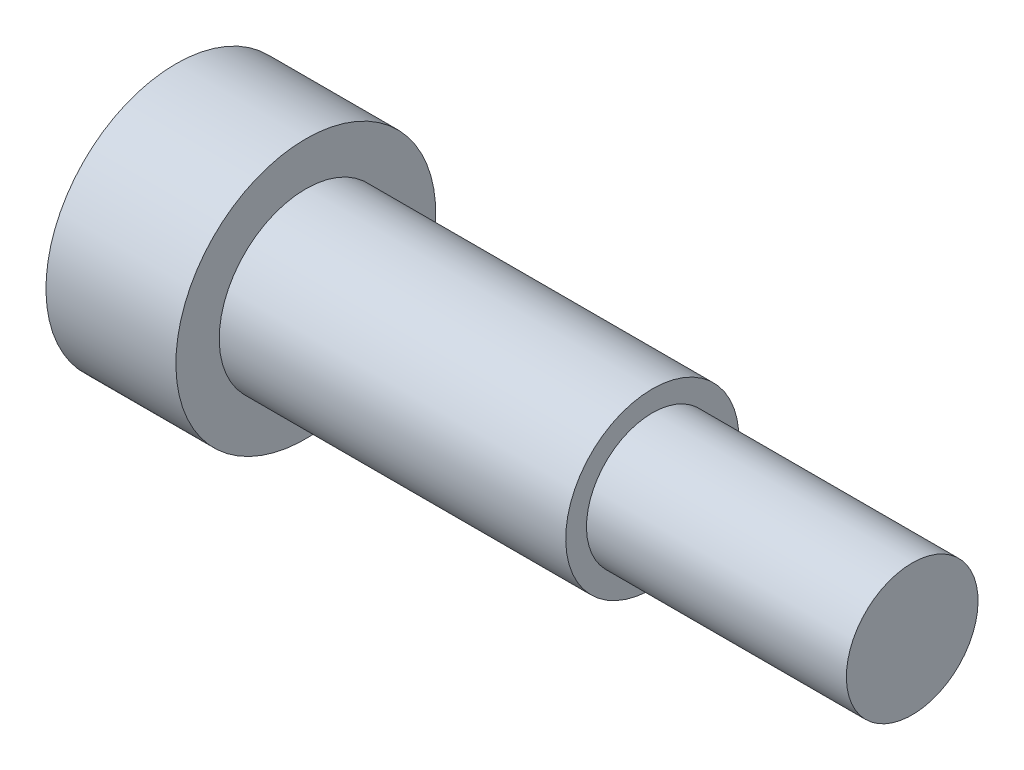
ISO-10303-21;
HEADER;
FILE_DESCRIPTION(('STEP AP214'),'2;1');
FILE_NAME('part.step','',(''),(''),'','','');
FILE_SCHEMA(('AUTOMOTIVE_DESIGN { 1 0 10303 214 1 1 1 1 }'));
ENDSEC;
DATA;
#1=APPLICATION_CONTEXT('core data for automotive mechanical design processes');
#2=APPLICATION_PROTOCOL_DEFINITION('international standard','automotive_design',2000,#1);
#3=PRODUCT_CONTEXT('',#1,'mechanical');
#4=PRODUCT('Part','Part','',(#3));
#5=PRODUCT_RELATED_PRODUCT_CATEGORY('part','',(#4));
#6=PRODUCT_DEFINITION_FORMATION('','',#4);
#7=PRODUCT_DEFINITION_CONTEXT('part definition',#1,'design');
#8=PRODUCT_DEFINITION('design','',#6,#7);
#9=PRODUCT_DEFINITION_SHAPE('','',#8);
#10=(LENGTH_UNIT() NAMED_UNIT(*) SI_UNIT(.MILLI.,.METRE.));
#11=(NAMED_UNIT(*) PLANE_ANGLE_UNIT() SI_UNIT($,.RADIAN.));
#12=(NAMED_UNIT(*) SI_UNIT($,.STERADIAN.) SOLID_ANGLE_UNIT());
#13=UNCERTAINTY_MEASURE_WITH_UNIT(LENGTH_MEASURE(1.E-05),#10,'distance_accuracy_value','');
#14=(GEOMETRIC_REPRESENTATION_CONTEXT(3) GLOBAL_UNCERTAINTY_ASSIGNED_CONTEXT((#13)) GLOBAL_UNIT_ASSIGNED_CONTEXT((#10,
#11,#12)) REPRESENTATION_CONTEXT('',''));
#15=CARTESIAN_POINT('',(0.,0.,0.));
#16=DIRECTION('',(0.,0.,1.));
#17=DIRECTION('',(1.,0.,0.));
#18=AXIS2_PLACEMENT_3D('',#15,#16,#17);
#19=CARTESIAN_POINT('',(0.,0.,0.));
#20=DIRECTION('',(-1.,0.,0.));
#21=DIRECTION('',(0.,-1.,0.));
#22=AXIS2_PLACEMENT_3D('',#19,#20,#21);
#23=PLANE('',#22);
#24=CARTESIAN_POINT('',(0.,0.,0.));
#25=DIRECTION('',(1.,0.,0.));
#26=DIRECTION('',(0.,1.,0.));
#27=AXIS2_PLACEMENT_3D('',#24,#25,#26);
#28=CIRCLE('',#27,4.7625);
#29=CARTESIAN_POINT('',(0.,4.7625,0.));
#30=VERTEX_POINT('',#29);
#31=EDGE_CURVE('E10',#30,#30,#28,.T.);
#32=ORIENTED_EDGE('',*,*,#31,.F.);
#33=EDGE_LOOP('',(#32));
#34=FACE_BOUND('',#33,.T.);
#35=ADVANCED_FACE('F37',(#34),#23,.T.);
#36=CARTESIAN_POINT('',(26.9875,0.,0.));
#37=DIRECTION('',(1.,0.,0.));
#38=DIRECTION('',(0.,1.,0.));
#39=AXIS2_PLACEMENT_3D('',#36,#37,#38);
#40=CYLINDRICAL_SURFACE('',#39,4.7625);
#41=ORIENTED_EDGE('',*,*,#31,.T.);
#42=EDGE_LOOP('',(#41));
#43=FACE_BOUND('',#42,.T.);
#44=CARTESIAN_POINT('',(4.7625,0.,0.));
#45=DIRECTION('',(1.,0.,0.));
#46=DIRECTION('',(0.,1.,0.));
#47=AXIS2_PLACEMENT_3D('',#44,#45,#46);
#48=CIRCLE('',#47,4.7625);
#49=CARTESIAN_POINT('',(4.7625,4.7625,0.));
#50=VERTEX_POINT('',#49);
#51=EDGE_CURVE('E44',#50,#50,#48,.T.);
#52=ORIENTED_EDGE('',*,*,#51,.F.);
#53=EDGE_LOOP('',(#52));
#54=FACE_BOUND('',#53,.T.);
#55=ADVANCED_FACE('F85',(#43,#54),#40,.T.);
#56=CARTESIAN_POINT('',(4.7625,4.7625,0.));
#57=DIRECTION('',(1.,0.,0.));
#58=DIRECTION('',(0.,1.,0.));
#59=AXIS2_PLACEMENT_3D('',#56,#57,#58);
#60=PLANE('',#59);
#61=ORIENTED_EDGE('',*,*,#51,.T.);
#62=EDGE_LOOP('',(#61));
#63=FACE_BOUND('',#62,.T.);
#64=CARTESIAN_POINT('',(4.7625,0.,0.));
#65=DIRECTION('',(1.,0.,0.));
#66=DIRECTION('',(0.,1.,0.));
#67=AXIS2_PLACEMENT_3D('',#64,#65,#66);
#68=CIRCLE('',#67,3.175);
#69=CARTESIAN_POINT('',(4.7625,3.175,0.));
#70=VERTEX_POINT('',#69);
#71=EDGE_CURVE('E49',#70,#70,#68,.T.);
#72=ORIENTED_EDGE('',*,*,#71,.F.);
#73=EDGE_LOOP('',(#72));
#74=FACE_BOUND('',#73,.T.);
#75=ADVANCED_FACE('F90',(#63,#74),#60,.T.);
#76=CARTESIAN_POINT('',(26.9875,0.,0.));
#77=DIRECTION('',(1.,0.,0.));
#78=DIRECTION('',(0.,1.,0.));
#79=AXIS2_PLACEMENT_3D('',#76,#77,#78);
#80=CYLINDRICAL_SURFACE('',#79,3.175);
#81=ORIENTED_EDGE('',*,*,#71,.T.);
#82=EDGE_LOOP('',(#81));
#83=FACE_BOUND('',#82,.T.);
#84=CARTESIAN_POINT('',(17.4625,0.,0.));
#85=DIRECTION('',(1.,0.,0.));
#86=DIRECTION('',(0.,1.,0.));
#87=AXIS2_PLACEMENT_3D('',#84,#85,#86);
#88=CIRCLE('',#87,3.175);
#89=CARTESIAN_POINT('',(17.4625,3.175,0.));
#90=VERTEX_POINT('',#89);
#91=EDGE_CURVE('E54',#90,#90,#88,.T.);
#92=ORIENTED_EDGE('',*,*,#91,.F.);
#93=EDGE_LOOP('',(#92));
#94=FACE_BOUND('',#93,.T.);
#95=ADVANCED_FACE('F81',(#83,#94),#80,.T.);
#96=CARTESIAN_POINT('',(17.4625,3.175,0.));
#97=DIRECTION('',(1.,0.,0.));
#98=DIRECTION('',(0.,1.,0.));
#99=AXIS2_PLACEMENT_3D('',#96,#97,#98);
#100=PLANE('',#99);
#101=ORIENTED_EDGE('',*,*,#91,.T.);
#102=EDGE_LOOP('',(#101));
#103=FACE_BOUND('',#102,.T.);
#104=CARTESIAN_POINT('',(17.4625,0.,0.));
#105=DIRECTION('',(1.,0.,0.));
#106=DIRECTION('',(0.,1.,0.));
#107=AXIS2_PLACEMENT_3D('',#104,#105,#106);
#108=CIRCLE('',#107,2.41300000000001);
#109=CARTESIAN_POINT('',(17.4625,2.413,0.));
#110=VERTEX_POINT('',#109);
#111=EDGE_CURVE('E60',#110,#110,#108,.T.);
#112=ORIENTED_EDGE('',*,*,#111,.F.);
#113=EDGE_LOOP('',(#112));
#114=FACE_BOUND('',#113,.T.);
#115=ADVANCED_FACE('F73',(#103,#114),#100,.T.);
#116=CARTESIAN_POINT('',(26.9875,0.,0.));
#117=DIRECTION('',(1.,0.,0.));
#118=DIRECTION('',(0.,1.,0.));
#119=AXIS2_PLACEMENT_3D('',#116,#117,#118);
#120=CYLINDRICAL_SURFACE('',#119,2.41300000000001);
#121=ORIENTED_EDGE('',*,*,#111,.T.);
#122=EDGE_LOOP('',(#121));
#123=FACE_BOUND('',#122,.T.);
#124=CARTESIAN_POINT('',(26.9875,0.,0.));
#125=DIRECTION('',(1.,0.,0.));
#126=DIRECTION('',(0.,1.,0.));
#127=AXIS2_PLACEMENT_3D('',#124,#125,#126);
#128=CIRCLE('',#127,2.41300000000001);
#129=CARTESIAN_POINT('',(26.9875,2.413,0.));
#130=VERTEX_POINT('',#129);
#131=EDGE_CURVE('E64',#130,#130,#128,.T.);
#132=ORIENTED_EDGE('',*,*,#131,.F.);
#133=EDGE_LOOP('',(#132));
#134=FACE_BOUND('',#133,.T.);
#135=ADVANCED_FACE('F71',(#123,#134),#120,.T.);
#136=CARTESIAN_POINT('',(26.9875,2.413,0.));
#137=DIRECTION('',(1.,0.,0.));
#138=DIRECTION('',(0.,1.,0.));
#139=AXIS2_PLACEMENT_3D('',#136,#137,#138);
#140=PLANE('',#139);
#141=ORIENTED_EDGE('',*,*,#131,.T.);
#142=EDGE_LOOP('',(#141));
#143=FACE_BOUND('',#142,.T.);
#144=ADVANCED_FACE('F69',(#143),#140,.T.);
#145=CLOSED_SHELL('',(#35,#55,#75,#95,#115,#135,#144));
#146=MANIFOLD_SOLID_BREP('B2',#145);
#147=ADVANCED_BREP_SHAPE_REPRESENTATION('',(#18,#146),#14);
#148=SHAPE_DEFINITION_REPRESENTATION(#9,#147);
ENDSEC;
END-ISO-10303-21;
